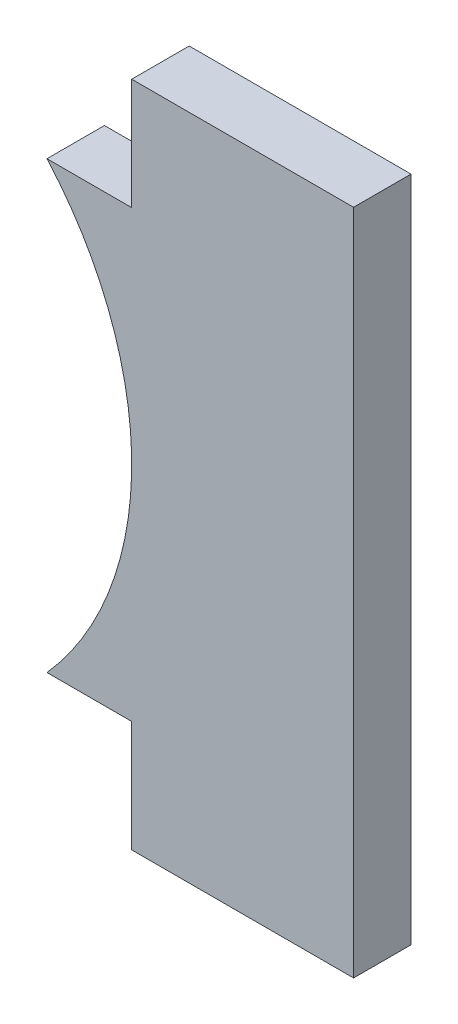
ISO-10303-21;
HEADER;
FILE_DESCRIPTION(('STEP AP214'),'2;1');
FILE_NAME('part.step','',(''),(''),'','','');
FILE_SCHEMA(('AUTOMOTIVE_DESIGN { 1 0 10303 214 1 1 1 1 }'));
ENDSEC;
DATA;
#1=APPLICATION_CONTEXT('core data for automotive mechanical design processes');
#2=APPLICATION_PROTOCOL_DEFINITION('international standard','automotive_design',2000,#1);
#3=PRODUCT_CONTEXT('',#1,'mechanical');
#4=PRODUCT('Part','Part','',(#3));
#5=PRODUCT_RELATED_PRODUCT_CATEGORY('part','',(#4));
#6=PRODUCT_DEFINITION_FORMATION('','',#4);
#7=PRODUCT_DEFINITION_CONTEXT('part definition',#1,'design');
#8=PRODUCT_DEFINITION('design','',#6,#7);
#9=PRODUCT_DEFINITION_SHAPE('','',#8);
#10=(LENGTH_UNIT() NAMED_UNIT(*) SI_UNIT(.MILLI.,.METRE.));
#11=(NAMED_UNIT(*) PLANE_ANGLE_UNIT() SI_UNIT($,.RADIAN.));
#12=(NAMED_UNIT(*) SI_UNIT($,.STERADIAN.) SOLID_ANGLE_UNIT());
#13=UNCERTAINTY_MEASURE_WITH_UNIT(LENGTH_MEASURE(1.E-05),#10,'distance_accuracy_value','');
#14=(GEOMETRIC_REPRESENTATION_CONTEXT(3) GLOBAL_UNCERTAINTY_ASSIGNED_CONTEXT((#13)) GLOBAL_UNIT_ASSIGNED_CONTEXT((#10,
#11,#12)) REPRESENTATION_CONTEXT('',''));
#15=CARTESIAN_POINT('',(0.,0.,0.));
#16=DIRECTION('',(0.,0.,1.));
#17=DIRECTION('',(1.,0.,0.));
#18=AXIS2_PLACEMENT_3D('',#15,#16,#17);
#19=CARTESIAN_POINT('',(0.,0.,-0.15));
#20=DIRECTION('',(0.,0.,-1.));
#21=DIRECTION('',(-1.,0.,0.));
#22=AXIS2_PLACEMENT_3D('',#19,#20,#21);
#23=PLANE('',#22);
#24=DIRECTION('',(-1.,0.,0.));
#25=VECTOR('',#24,1.);
#26=CARTESIAN_POINT('',(0.,0.6,-0.15));
#27=LINE('',#26,#25);
#28=CARTESIAN_POINT('',(0.673215327782742,0.6,-0.15));
#29=VERTEX_POINT('',#28);
#30=CARTESIAN_POINT('',(0.901786492226,0.6,-0.15));
#31=VERTEX_POINT('',#30);
#32=EDGE_CURVE('E84',#29,#31,#27,.F.);
#33=ORIENTED_EDGE('',*,*,#32,.T.);
#34=DIRECTION('',(0.,1.,0.));
#35=VECTOR('',#34,1.);
#36=CARTESIAN_POINT('',(0.901786492226,0.,-0.15));
#37=LINE('',#36,#35);
#38=CARTESIAN_POINT('',(0.901786492226,0.9,-0.15));
#39=VERTEX_POINT('',#38);
#40=EDGE_CURVE('E100',#31,#39,#37,.T.);
#41=ORIENTED_EDGE('',*,*,#40,.T.);
#42=DIRECTION('',(-1.,0.,0.));
#43=VECTOR('',#42,1.);
#44=CARTESIAN_POINT('',(0.,0.9,-0.15));
#45=LINE('',#44,#43);
#46=CARTESIAN_POINT('',(1.5,0.9,-0.15));
#47=VERTEX_POINT('',#46);
#48=EDGE_CURVE('E114',#39,#47,#45,.F.);
#49=ORIENTED_EDGE('',*,*,#48,.T.);
#50=DIRECTION('',(0.,-1.,0.));
#51=VECTOR('',#50,1.);
#52=CARTESIAN_POINT('',(1.5,0.9,-0.15));
#53=LINE('',#52,#51);
#54=CARTESIAN_POINT('',(1.5,-0.9,-0.15));
#55=VERTEX_POINT('',#54);
#56=EDGE_CURVE('E102',#47,#55,#53,.T.);
#57=ORIENTED_EDGE('',*,*,#56,.T.);
#58=DIRECTION('',(-1.,0.,0.));
#59=VECTOR('',#58,1.);
#60=CARTESIAN_POINT('',(0.,-0.9,-0.15));
#61=LINE('',#60,#59);
#62=CARTESIAN_POINT('',(0.901786492226,-0.9,-0.15));
#63=VERTEX_POINT('',#62);
#64=EDGE_CURVE('E116',#55,#63,#61,.T.);
#65=ORIENTED_EDGE('',*,*,#64,.T.);
#66=DIRECTION('',(0.,1.,0.));
#67=VECTOR('',#66,1.);
#68=CARTESIAN_POINT('',(0.901786492226,0.,-0.15));
#69=LINE('',#68,#67);
#70=CARTESIAN_POINT('',(0.901786492226,-0.6,-0.15));
#71=VERTEX_POINT('',#70);
#72=EDGE_CURVE('E111',#63,#71,#69,.T.);
#73=ORIENTED_EDGE('',*,*,#72,.T.);
#74=DIRECTION('',(-1.,0.,0.));
#75=VECTOR('',#74,1.);
#76=CARTESIAN_POINT('',(0.,-0.6,-0.15));
#77=LINE('',#76,#75);
#78=CARTESIAN_POINT('',(0.673215327782591,-0.599999999999869,-0.15));
#79=VERTEX_POINT('',#78);
#80=EDGE_CURVE('E79',#71,#79,#77,.T.);
#81=ORIENTED_EDGE('',*,*,#80,.T.);
#82=CARTESIAN_POINT('',(0.,0.,-0.15));
#83=DIRECTION('',(0.,0.,-1.));
#84=DIRECTION('',(-1.,0.,0.));
#85=AXIS2_PLACEMENT_3D('',#82,#83,#84);
#86=CIRCLE('',#85,0.901786492226);
#87=EDGE_CURVE('E20',#79,#29,#86,.F.);
#88=ORIENTED_EDGE('',*,*,#87,.T.);
#89=EDGE_LOOP('',(#33,#41,#49,#57,#65,#73,#81,#88));
#90=FACE_BOUND('',#89,.T.);
#91=ADVANCED_FACE('F17',(#90),#23,.T.);
#92=CARTESIAN_POINT('',(1.5,0.9,0.005));
#93=DIRECTION('',(-1.,0.,0.));
#94=DIRECTION('',(0.,-1.,0.));
#95=AXIS2_PLACEMENT_3D('',#92,#93,#94);
#96=PLANE('',#95);
#97=ORIENTED_EDGE('',*,*,#56,.F.);
#98=DIRECTION('',(0.,0.,1.));
#99=VECTOR('',#98,1.);
#100=CARTESIAN_POINT('',(1.5,0.9,0.005));
#101=LINE('',#100,#99);
#102=CARTESIAN_POINT('',(1.5,0.9,0.005));
#103=VERTEX_POINT('',#102);
#104=EDGE_CURVE('E125',#47,#103,#101,.T.);
#105=ORIENTED_EDGE('',*,*,#104,.T.);
#106=DIRECTION('',(0.,1.,0.));
#107=VECTOR('',#106,1.);
#108=CARTESIAN_POINT('',(1.5,0.,0.005));
#109=LINE('',#108,#107);
#110=CARTESIAN_POINT('',(1.5,-0.9,0.005));
#111=VERTEX_POINT('',#110);
#112=EDGE_CURVE('E169',#103,#111,#109,.F.);
#113=ORIENTED_EDGE('',*,*,#112,.T.);
#114=DIRECTION('',(0.,0.,1.));
#115=VECTOR('',#114,1.);
#116=CARTESIAN_POINT('',(1.5,-0.9,0.005));
#117=LINE('',#116,#115);
#118=EDGE_CURVE('E164',#111,#55,#117,.F.);
#119=ORIENTED_EDGE('',*,*,#118,.T.);
#120=EDGE_LOOP('',(#97,#105,#113,#119));
#121=FACE_BOUND('',#120,.T.);
#122=ADVANCED_FACE('F189',(#121),#96,.F.);
#123=CARTESIAN_POINT('',(1.5,-0.9,0.005));
#124=DIRECTION('',(0.,1.,0.));
#125=DIRECTION('',(-1.,0.,0.));
#126=AXIS2_PLACEMENT_3D('',#123,#124,#125);
#127=PLANE('',#126);
#128=ORIENTED_EDGE('',*,*,#64,.F.);
#129=ORIENTED_EDGE('',*,*,#118,.F.);
#130=DIRECTION('',(-1.,0.,0.));
#131=VECTOR('',#130,1.);
#132=CARTESIAN_POINT('',(0.,-0.9,0.005));
#133=LINE('',#132,#131);
#134=CARTESIAN_POINT('',(0.901786492226,-0.9,0.005));
#135=VERTEX_POINT('',#134);
#136=EDGE_CURVE('E139',#111,#135,#133,.T.);
#137=ORIENTED_EDGE('',*,*,#136,.T.);
#138=DIRECTION('',(0.,0.,-1.));
#139=VECTOR('',#138,1.);
#140=CARTESIAN_POINT('',(0.901786492226,-0.9,0.005));
#141=LINE('',#140,#139);
#142=EDGE_CURVE('E157',#135,#63,#141,.T.);
#143=ORIENTED_EDGE('',*,*,#142,.T.);
#144=EDGE_LOOP('',(#128,#129,#137,#143));
#145=FACE_BOUND('',#144,.T.);
#146=ADVANCED_FACE('F192',(#145),#127,.F.);
#147=CARTESIAN_POINT('',(0.901786492226,-0.9,0.005));
#148=DIRECTION('',(1.,0.,0.));
#149=DIRECTION('',(0.,0.,-1.));
#150=AXIS2_PLACEMENT_3D('',#147,#148,#149);
#151=PLANE('',#150);
#152=ORIENTED_EDGE('',*,*,#72,.F.);
#153=ORIENTED_EDGE('',*,*,#142,.F.);
#154=DIRECTION('',(0.,1.,0.));
#155=VECTOR('',#154,1.);
#156=CARTESIAN_POINT('',(0.901786492226,0.,0.005));
#157=LINE('',#156,#155);
#158=CARTESIAN_POINT('',(0.901786492226,-0.6,0.005));
#159=VERTEX_POINT('',#158);
#160=EDGE_CURVE('E134',#135,#159,#157,.T.);
#161=ORIENTED_EDGE('',*,*,#160,.T.);
#162=DIRECTION('',(0.,0.,1.));
#163=VECTOR('',#162,1.);
#164=CARTESIAN_POINT('',(0.901786492226,-0.599999999999999,0.005));
#165=LINE('',#164,#163);
#166=EDGE_CURVE('E154',#159,#71,#165,.F.);
#167=ORIENTED_EDGE('',*,*,#166,.T.);
#168=EDGE_LOOP('',(#152,#153,#161,#167));
#169=FACE_BOUND('',#168,.T.);
#170=ADVANCED_FACE('F199',(#169),#151,.F.);
#171=CARTESIAN_POINT('',(0.673215327783,-0.6,0.005));
#172=DIRECTION('',(0.,1.,0.));
#173=DIRECTION('',(-1.,0.,0.));
#174=AXIS2_PLACEMENT_3D('',#171,#172,#173);
#175=PLANE('',#174);
#176=ORIENTED_EDGE('',*,*,#80,.F.);
#177=ORIENTED_EDGE('',*,*,#166,.F.);
#178=DIRECTION('',(-1.,0.,0.));
#179=VECTOR('',#178,1.);
#180=CARTESIAN_POINT('',(0.,-0.6,0.005));
#181=LINE('',#180,#179);
#182=CARTESIAN_POINT('',(0.673215327782591,-0.599999999999869,0.005));
#183=VERTEX_POINT('',#182);
#184=EDGE_CURVE('E131',#159,#183,#181,.T.);
#185=ORIENTED_EDGE('',*,*,#184,.T.);
#186=DIRECTION('',(0.,0.,-1.));
#187=VECTOR('',#186,1.);
#188=CARTESIAN_POINT('',(0.673215327782707,-0.599999999999739,0.005));
#189=LINE('',#188,#187);
#190=EDGE_CURVE('E96',#183,#79,#189,.T.);
#191=ORIENTED_EDGE('',*,*,#190,.T.);
#192=EDGE_LOOP('',(#176,#177,#185,#191));
#193=FACE_BOUND('',#192,.T.);
#194=ADVANCED_FACE('F200',(#193),#175,.F.);
#195=CARTESIAN_POINT('',(0.,0.,0.005));
#196=DIRECTION('',(0.,0.,-1.));
#197=DIRECTION('',(-1.,0.,0.));
#198=AXIS2_PLACEMENT_3D('',#195,#196,#197);
#199=CYLINDRICAL_SURFACE('',#198,0.901786492226);
#200=ORIENTED_EDGE('',*,*,#87,.F.);
#201=ORIENTED_EDGE('',*,*,#190,.F.);
#202=CARTESIAN_POINT('',(0.,0.,0.005));
#203=DIRECTION('',(0.,0.,-1.));
#204=DIRECTION('',(-1.,0.,0.));
#205=AXIS2_PLACEMENT_3D('',#202,#203,#204);
#206=CIRCLE('',#205,0.901786492226);
#207=CARTESIAN_POINT('',(0.673215327782742,0.6,0.005));
#208=VERTEX_POINT('',#207);
#209=EDGE_CURVE('E91',#183,#208,#206,.F.);
#210=ORIENTED_EDGE('',*,*,#209,.T.);
#211=DIRECTION('',(0.,0.,-1.));
#212=VECTOR('',#211,1.);
#213=CARTESIAN_POINT('',(0.673215327783,0.6,0.005));
#214=LINE('',#213,#212);
#215=EDGE_CURVE('E88',#208,#29,#214,.T.);
#216=ORIENTED_EDGE('',*,*,#215,.T.);
#217=EDGE_LOOP('',(#200,#201,#210,#216));
#218=FACE_BOUND('',#217,.T.);
#219=ADVANCED_FACE('F89',(#218),#199,.F.);
#220=CARTESIAN_POINT('',(0.673215327783,0.6,0.005));
#221=DIRECTION('',(0.,-1.,0.));
#222=DIRECTION('',(0.,0.,-1.));
#223=AXIS2_PLACEMENT_3D('',#220,#221,#222);
#224=PLANE('',#223);
#225=ORIENTED_EDGE('',*,*,#32,.F.);
#226=ORIENTED_EDGE('',*,*,#215,.F.);
#227=DIRECTION('',(-1.,0.,0.));
#228=VECTOR('',#227,1.);
#229=CARTESIAN_POINT('',(0.,0.6,0.005));
#230=LINE('',#229,#228);
#231=CARTESIAN_POINT('',(0.901786492226,0.6,0.005));
#232=VERTEX_POINT('',#231);
#233=EDGE_CURVE('E130',#208,#232,#230,.F.);
#234=ORIENTED_EDGE('',*,*,#233,.T.);
#235=DIRECTION('',(0.,0.,-1.));
#236=VECTOR('',#235,1.);
#237=CARTESIAN_POINT('',(0.901786492226,0.6,0.005));
#238=LINE('',#237,#236);
#239=EDGE_CURVE('E95',#232,#31,#238,.T.);
#240=ORIENTED_EDGE('',*,*,#239,.T.);
#241=EDGE_LOOP('',(#225,#226,#234,#240));
#242=FACE_BOUND('',#241,.T.);
#243=ADVANCED_FACE('F98',(#242),#224,.F.);
#244=CARTESIAN_POINT('',(0.901786492226,0.9,0.005));
#245=DIRECTION('',(1.,0.,0.));
#246=DIRECTION('',(0.,0.,-1.));
#247=AXIS2_PLACEMENT_3D('',#244,#245,#246);
#248=PLANE('',#247);
#249=ORIENTED_EDGE('',*,*,#40,.F.);
#250=ORIENTED_EDGE('',*,*,#239,.F.);
#251=DIRECTION('',(0.,1.,0.));
#252=VECTOR('',#251,1.);
#253=CARTESIAN_POINT('',(0.901786492226,0.,0.005));
#254=LINE('',#253,#252);
#255=CARTESIAN_POINT('',(0.901786492226,0.9,0.005));
#256=VERTEX_POINT('',#255);
#257=EDGE_CURVE('E26',#232,#256,#254,.T.);
#258=ORIENTED_EDGE('',*,*,#257,.T.);
#259=DIRECTION('',(0.,0.,1.));
#260=VECTOR('',#259,1.);
#261=CARTESIAN_POINT('',(0.901786492226,0.9,0.005));
#262=LINE('',#261,#260);
#263=EDGE_CURVE('E34',#256,#39,#262,.F.);
#264=ORIENTED_EDGE('',*,*,#263,.T.);
#265=EDGE_LOOP('',(#249,#250,#258,#264));
#266=FACE_BOUND('',#265,.T.);
#267=ADVANCED_FACE('F202',(#266),#248,.F.);
#268=CARTESIAN_POINT('',(1.5,0.9,0.005));
#269=DIRECTION('',(0.,-1.,0.));
#270=DIRECTION('',(1.,0.,0.));
#271=AXIS2_PLACEMENT_3D('',#268,#269,#270);
#272=PLANE('',#271);
#273=ORIENTED_EDGE('',*,*,#48,.F.);
#274=ORIENTED_EDGE('',*,*,#263,.F.);
#275=DIRECTION('',(-1.,0.,0.));
#276=VECTOR('',#275,1.);
#277=CARTESIAN_POINT('',(0.,0.9,0.005));
#278=LINE('',#277,#276);
#279=EDGE_CURVE('E11',#256,#103,#278,.F.);
#280=ORIENTED_EDGE('',*,*,#279,.T.);
#281=ORIENTED_EDGE('',*,*,#104,.F.);
#282=EDGE_LOOP('',(#273,#274,#280,#281));
#283=FACE_BOUND('',#282,.T.);
#284=ADVANCED_FACE('F203',(#283),#272,.F.);
#285=CARTESIAN_POINT('',(0.,0.,0.005));
#286=DIRECTION('',(0.,0.,-1.));
#287=DIRECTION('',(-1.,0.,0.));
#288=AXIS2_PLACEMENT_3D('',#285,#286,#287);
#289=PLANE('',#288);
#290=ORIENTED_EDGE('',*,*,#257,.F.);
#291=ORIENTED_EDGE('',*,*,#233,.F.);
#292=ORIENTED_EDGE('',*,*,#209,.F.);
#293=ORIENTED_EDGE('',*,*,#184,.F.);
#294=ORIENTED_EDGE('',*,*,#160,.F.);
#295=ORIENTED_EDGE('',*,*,#136,.F.);
#296=ORIENTED_EDGE('',*,*,#112,.F.);
#297=ORIENTED_EDGE('',*,*,#279,.F.);
#298=EDGE_LOOP('',(#290,#291,#292,#293,#294,#295,#296,#297));
#299=FACE_BOUND('',#298,.T.);
#300=ADVANCED_FACE('F196',(#299),#289,.F.);
#301=CLOSED_SHELL('',(#91,#122,#146,#170,#194,#219,#243,#267,#284,#300));
#302=MANIFOLD_SOLID_BREP('B1',#301);
#303=ADVANCED_BREP_SHAPE_REPRESENTATION('',(#18,#302),#14);
#304=SHAPE_DEFINITION_REPRESENTATION(#9,#303);
ENDSEC;
END-ISO-10303-21;
